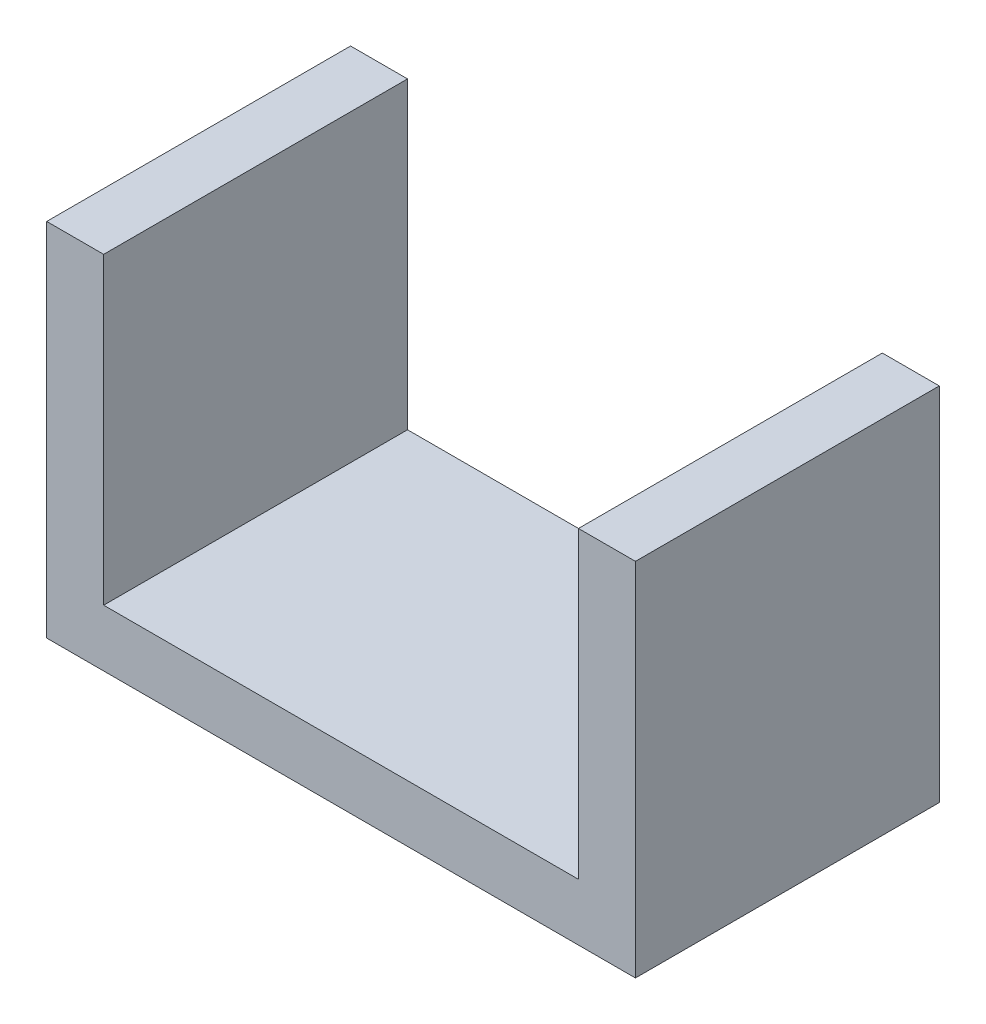
ISO-10303-21;
HEADER;
FILE_DESCRIPTION(('STEP AP214'),'2;1');
FILE_NAME('part.step','',(''),(''),'','','');
FILE_SCHEMA(('AUTOMOTIVE_DESIGN { 1 0 10303 214 1 1 1 1 }'));
ENDSEC;
DATA;
#1=APPLICATION_CONTEXT('core data for automotive mechanical design processes');
#2=APPLICATION_PROTOCOL_DEFINITION('international standard','automotive_design',2000,#1);
#3=PRODUCT_CONTEXT('',#1,'mechanical');
#4=PRODUCT('Part','Part','',(#3));
#5=PRODUCT_RELATED_PRODUCT_CATEGORY('part','',(#4));
#6=PRODUCT_DEFINITION_FORMATION('','',#4);
#7=PRODUCT_DEFINITION_CONTEXT('part definition',#1,'design');
#8=PRODUCT_DEFINITION('design','',#6,#7);
#9=PRODUCT_DEFINITION_SHAPE('','',#8);
#10=(LENGTH_UNIT() NAMED_UNIT(*) SI_UNIT(.MILLI.,.METRE.));
#11=(NAMED_UNIT(*) PLANE_ANGLE_UNIT() SI_UNIT($,.RADIAN.));
#12=(NAMED_UNIT(*) SI_UNIT($,.STERADIAN.) SOLID_ANGLE_UNIT());
#13=UNCERTAINTY_MEASURE_WITH_UNIT(LENGTH_MEASURE(1.E-05),#10,'distance_accuracy_value','');
#14=(GEOMETRIC_REPRESENTATION_CONTEXT(3) GLOBAL_UNCERTAINTY_ASSIGNED_CONTEXT((#13)) GLOBAL_UNIT_ASSIGNED_CONTEXT((#10,
#11,#12)) REPRESENTATION_CONTEXT('',''));
#15=CARTESIAN_POINT('',(0.,0.,0.));
#16=DIRECTION('',(0.,0.,1.));
#17=DIRECTION('',(1.,0.,0.));
#18=AXIS2_PLACEMENT_3D('',#15,#16,#17);
#19=CARTESIAN_POINT('',(-8.07882416440109,5.56775147928994,8.));
#20=DIRECTION('',(0.,-1.,0.));
#21=DIRECTION('',(0.,0.,-1.));
#22=AXIS2_PLACEMENT_3D('',#19,#20,#21);
#23=PLANE('',#22);
#24=DIRECTION('',(-1.,0.,0.));
#25=VECTOR('',#24,1.);
#26=CARTESIAN_POINT('',(-8.07882416440109,5.56775147928994,0.));
#27=LINE('',#26,#25);
#28=CARTESIAN_POINT('',(-8.07882416440109,5.56775147928994,0.));
#29=VERTEX_POINT('',#28);
#30=CARTESIAN_POINT('',(-9.57882416440109,5.56775147928994,0.));
#31=VERTEX_POINT('',#30);
#32=EDGE_CURVE('E140',#29,#31,#27,.T.);
#33=ORIENTED_EDGE('',*,*,#32,.T.);
#34=DIRECTION('',(0.,0.,-1.));
#35=VECTOR('',#34,1.);
#36=CARTESIAN_POINT('',(-9.57882416440109,5.56775147928994,8.));
#37=LINE('',#36,#35);
#38=CARTESIAN_POINT('',(-9.57882416440109,5.56775147928994,8.));
#39=VERTEX_POINT('',#38);
#40=EDGE_CURVE('E11',#39,#31,#37,.T.);
#41=ORIENTED_EDGE('',*,*,#40,.F.);
#42=DIRECTION('',(-1.,0.,0.));
#43=VECTOR('',#42,1.);
#44=CARTESIAN_POINT('',(-8.07882416440109,5.56775147928994,8.));
#45=LINE('',#44,#43);
#46=CARTESIAN_POINT('',(-8.07882416440109,5.56775147928994,8.));
#47=VERTEX_POINT('',#46);
#48=EDGE_CURVE('E162',#47,#39,#45,.T.);
#49=ORIENTED_EDGE('',*,*,#48,.F.);
#50=DIRECTION('',(0.,0.,-1.));
#51=VECTOR('',#50,1.);
#52=CARTESIAN_POINT('',(-8.07882416440109,5.56775147928994,8.));
#53=LINE('',#52,#51);
#54=EDGE_CURVE('E136',#47,#29,#53,.T.);
#55=ORIENTED_EDGE('',*,*,#54,.T.);
#56=EDGE_LOOP('',(#33,#41,#49,#55));
#57=FACE_BOUND('',#56,.T.);
#58=ADVANCED_FACE('F39',(#57),#23,.F.);
#59=CARTESIAN_POINT('',(-9.57882416440109,5.56775147928994,8.));
#60=DIRECTION('',(1.,0.,0.));
#61=DIRECTION('',(0.,0.,-1.));
#62=AXIS2_PLACEMENT_3D('',#59,#60,#61);
#63=PLANE('',#62);
#64=DIRECTION('',(0.,-1.,0.));
#65=VECTOR('',#64,1.);
#66=CARTESIAN_POINT('',(-9.57882416440109,5.56775147928994,0.));
#67=LINE('',#66,#65);
#68=CARTESIAN_POINT('',(-9.57882416440109,-3.93224852071006,0.));
#69=VERTEX_POINT('',#68);
#70=EDGE_CURVE('E144',#31,#69,#67,.T.);
#71=ORIENTED_EDGE('',*,*,#70,.T.);
#72=DIRECTION('',(0.,0.,-1.));
#73=VECTOR('',#72,1.);
#74=CARTESIAN_POINT('',(-9.57882416440109,-3.93224852071006,8.));
#75=LINE('',#74,#73);
#76=CARTESIAN_POINT('',(-9.57882416440109,-3.93224852071006,8.));
#77=VERTEX_POINT('',#76);
#78=EDGE_CURVE('E48',#77,#69,#75,.T.);
#79=ORIENTED_EDGE('',*,*,#78,.F.);
#80=DIRECTION('',(0.,-1.,0.));
#81=VECTOR('',#80,1.);
#82=CARTESIAN_POINT('',(-9.57882416440109,5.56775147928994,8.));
#83=LINE('',#82,#81);
#84=EDGE_CURVE('E99',#39,#77,#83,.T.);
#85=ORIENTED_EDGE('',*,*,#84,.F.);
#86=ORIENTED_EDGE('',*,*,#40,.T.);
#87=EDGE_LOOP('',(#71,#79,#85,#86));
#88=FACE_BOUND('',#87,.T.);
#89=ADVANCED_FACE('F208',(#88),#63,.F.);
#90=CARTESIAN_POINT('',(-9.57882416440109,-3.93224852071006,8.));
#91=DIRECTION('',(0.,1.,0.));
#92=DIRECTION('',(0.,0.,1.));
#93=AXIS2_PLACEMENT_3D('',#90,#91,#92);
#94=PLANE('',#93);
#95=DIRECTION('',(1.,0.,0.));
#96=VECTOR('',#95,1.);
#97=CARTESIAN_POINT('',(-9.57882416440109,-3.93224852071006,0.));
#98=LINE('',#97,#96);
#99=CARTESIAN_POINT('',(5.92117583559891,-3.93224852071006,0.));
#100=VERTEX_POINT('',#99);
#101=EDGE_CURVE('E147',#69,#100,#98,.T.);
#102=ORIENTED_EDGE('',*,*,#101,.T.);
#103=DIRECTION('',(0.,0.,-1.));
#104=VECTOR('',#103,1.);
#105=CARTESIAN_POINT('',(5.92117583559891,-3.93224852071006,8.));
#106=LINE('',#105,#104);
#107=CARTESIAN_POINT('',(5.92117583559891,-3.93224852071006,8.));
#108=VERTEX_POINT('',#107);
#109=EDGE_CURVE('E173',#108,#100,#106,.T.);
#110=ORIENTED_EDGE('',*,*,#109,.F.);
#111=DIRECTION('',(1.,0.,0.));
#112=VECTOR('',#111,1.);
#113=CARTESIAN_POINT('',(-9.57882416440109,-3.93224852071006,8.));
#114=LINE('',#113,#112);
#115=EDGE_CURVE('E183',#77,#108,#114,.T.);
#116=ORIENTED_EDGE('',*,*,#115,.F.);
#117=ORIENTED_EDGE('',*,*,#78,.T.);
#118=EDGE_LOOP('',(#102,#110,#116,#117));
#119=FACE_BOUND('',#118,.T.);
#120=ADVANCED_FACE('F181',(#119),#94,.F.);
#121=CARTESIAN_POINT('',(5.92117583559891,-3.93224852071006,8.));
#122=DIRECTION('',(-1.,0.,0.));
#123=DIRECTION('',(0.,-1.,0.));
#124=AXIS2_PLACEMENT_3D('',#121,#122,#123);
#125=PLANE('',#124);
#126=DIRECTION('',(0.,1.,0.));
#127=VECTOR('',#126,1.);
#128=CARTESIAN_POINT('',(5.92117583559891,-3.93224852071006,0.));
#129=LINE('',#128,#127);
#130=CARTESIAN_POINT('',(5.92117583559891,5.56775147928994,0.));
#131=VERTEX_POINT('',#130);
#132=EDGE_CURVE('E150',#100,#131,#129,.T.);
#133=ORIENTED_EDGE('',*,*,#132,.T.);
#134=DIRECTION('',(0.,0.,-1.));
#135=VECTOR('',#134,1.);
#136=CARTESIAN_POINT('',(5.92117583559891,5.56775147928994,8.));
#137=LINE('',#136,#135);
#138=CARTESIAN_POINT('',(5.92117583559891,5.56775147928994,8.));
#139=VERTEX_POINT('',#138);
#140=EDGE_CURVE('E169',#139,#131,#137,.T.);
#141=ORIENTED_EDGE('',*,*,#140,.F.);
#142=DIRECTION('',(0.,1.,0.));
#143=VECTOR('',#142,1.);
#144=CARTESIAN_POINT('',(5.92117583559891,-3.93224852071006,8.));
#145=LINE('',#144,#143);
#146=EDGE_CURVE('E196',#108,#139,#145,.T.);
#147=ORIENTED_EDGE('',*,*,#146,.F.);
#148=ORIENTED_EDGE('',*,*,#109,.T.);
#149=EDGE_LOOP('',(#133,#141,#147,#148));
#150=FACE_BOUND('',#149,.T.);
#151=ADVANCED_FACE('F191',(#150),#125,.F.);
#152=CARTESIAN_POINT('',(5.92117583559891,5.56775147928994,8.));
#153=DIRECTION('',(0.,-1.,0.));
#154=DIRECTION('',(0.,0.,-1.));
#155=AXIS2_PLACEMENT_3D('',#152,#153,#154);
#156=PLANE('',#155);
#157=DIRECTION('',(-1.,0.,0.));
#158=VECTOR('',#157,1.);
#159=CARTESIAN_POINT('',(5.92117583559891,5.56775147928994,0.));
#160=LINE('',#159,#158);
#161=CARTESIAN_POINT('',(4.42117583559891,5.56775147928994,0.));
#162=VERTEX_POINT('',#161);
#163=EDGE_CURVE('E153',#131,#162,#160,.T.);
#164=ORIENTED_EDGE('',*,*,#163,.T.);
#165=DIRECTION('',(0.,0.,-1.));
#166=VECTOR('',#165,1.);
#167=CARTESIAN_POINT('',(4.42117583559891,5.56775147928994,8.));
#168=LINE('',#167,#166);
#169=CARTESIAN_POINT('',(4.42117583559891,5.56775147928994,8.));
#170=VERTEX_POINT('',#169);
#171=EDGE_CURVE('E129',#170,#162,#168,.T.);
#172=ORIENTED_EDGE('',*,*,#171,.F.);
#173=DIRECTION('',(-1.,0.,0.));
#174=VECTOR('',#173,1.);
#175=CARTESIAN_POINT('',(5.92117583559891,5.56775147928994,8.));
#176=LINE('',#175,#174);
#177=EDGE_CURVE('E118',#139,#170,#176,.T.);
#178=ORIENTED_EDGE('',*,*,#177,.F.);
#179=ORIENTED_EDGE('',*,*,#140,.T.);
#180=EDGE_LOOP('',(#164,#172,#178,#179));
#181=FACE_BOUND('',#180,.T.);
#182=ADVANCED_FACE('F194',(#181),#156,.F.);
#183=CARTESIAN_POINT('',(4.42117583559891,5.56775147928994,8.));
#184=DIRECTION('',(1.,0.,0.));
#185=DIRECTION('',(0.,1.,0.));
#186=AXIS2_PLACEMENT_3D('',#183,#184,#185);
#187=PLANE('',#186);
#188=DIRECTION('',(0.,-1.,0.));
#189=VECTOR('',#188,1.);
#190=CARTESIAN_POINT('',(4.42117583559891,5.56775147928994,0.));
#191=LINE('',#190,#189);
#192=CARTESIAN_POINT('',(4.42117583559891,-2.43224852071006,0.));
#193=VERTEX_POINT('',#192);
#194=EDGE_CURVE('E127',#162,#193,#191,.T.);
#195=ORIENTED_EDGE('',*,*,#194,.T.);
#196=DIRECTION('',(0.,0.,-1.));
#197=VECTOR('',#196,1.);
#198=CARTESIAN_POINT('',(4.42117583559891,-2.43224852071006,8.));
#199=LINE('',#198,#197);
#200=CARTESIAN_POINT('',(4.42117583559891,-2.43224852071006,8.));
#201=VERTEX_POINT('',#200);
#202=EDGE_CURVE('E124',#201,#193,#199,.T.);
#203=ORIENTED_EDGE('',*,*,#202,.F.);
#204=DIRECTION('',(0.,-1.,0.));
#205=VECTOR('',#204,1.);
#206=CARTESIAN_POINT('',(4.42117583559891,5.56775147928994,8.));
#207=LINE('',#206,#205);
#208=EDGE_CURVE('E112',#170,#201,#207,.T.);
#209=ORIENTED_EDGE('',*,*,#208,.F.);
#210=ORIENTED_EDGE('',*,*,#171,.T.);
#211=EDGE_LOOP('',(#195,#203,#209,#210));
#212=FACE_BOUND('',#211,.T.);
#213=ADVANCED_FACE('F125',(#212),#187,.F.);
#214=CARTESIAN_POINT('',(4.42117583559891,-2.43224852071006,8.));
#215=DIRECTION('',(0.,-1.,0.));
#216=DIRECTION('',(1.,0.,0.));
#217=AXIS2_PLACEMENT_3D('',#214,#215,#216);
#218=PLANE('',#217);
#219=DIRECTION('',(-1.,0.,0.));
#220=VECTOR('',#219,1.);
#221=CARTESIAN_POINT('',(4.42117583559891,-2.43224852071006,0.));
#222=LINE('',#221,#220);
#223=CARTESIAN_POINT('',(-8.07882416440109,-2.43224852071006,0.));
#224=VERTEX_POINT('',#223);
#225=EDGE_CURVE('E85',#193,#224,#222,.T.);
#226=ORIENTED_EDGE('',*,*,#225,.T.);
#227=DIRECTION('',(0.,0.,-1.));
#228=VECTOR('',#227,1.);
#229=CARTESIAN_POINT('',(-8.07882416440109,-2.43224852071006,8.));
#230=LINE('',#229,#228);
#231=CARTESIAN_POINT('',(-8.07882416440109,-2.43224852071006,8.));
#232=VERTEX_POINT('',#231);
#233=EDGE_CURVE('E130',#232,#224,#230,.T.);
#234=ORIENTED_EDGE('',*,*,#233,.F.);
#235=DIRECTION('',(-1.,0.,0.));
#236=VECTOR('',#235,1.);
#237=CARTESIAN_POINT('',(4.42117583559891,-2.43224852071006,8.));
#238=LINE('',#237,#236);
#239=EDGE_CURVE('E116',#201,#232,#238,.T.);
#240=ORIENTED_EDGE('',*,*,#239,.F.);
#241=ORIENTED_EDGE('',*,*,#202,.T.);
#242=EDGE_LOOP('',(#226,#234,#240,#241));
#243=FACE_BOUND('',#242,.T.);
#244=ADVANCED_FACE('F132',(#243),#218,.F.);
#245=CARTESIAN_POINT('',(-8.07882416440109,-2.43224852071006,8.));
#246=DIRECTION('',(-1.,0.,0.));
#247=DIRECTION('',(0.,0.,1.));
#248=AXIS2_PLACEMENT_3D('',#245,#246,#247);
#249=PLANE('',#248);
#250=DIRECTION('',(0.,1.,0.));
#251=VECTOR('',#250,1.);
#252=CARTESIAN_POINT('',(-8.07882416440109,-2.43224852071006,0.));
#253=LINE('',#252,#251);
#254=EDGE_CURVE('E91',#224,#29,#253,.T.);
#255=ORIENTED_EDGE('',*,*,#254,.T.);
#256=ORIENTED_EDGE('',*,*,#54,.F.);
#257=DIRECTION('',(0.,1.,0.));
#258=VECTOR('',#257,1.);
#259=CARTESIAN_POINT('',(-8.07882416440109,-2.43224852071006,8.));
#260=LINE('',#259,#258);
#261=EDGE_CURVE('E56',#232,#47,#260,.T.);
#262=ORIENTED_EDGE('',*,*,#261,.F.);
#263=ORIENTED_EDGE('',*,*,#233,.T.);
#264=EDGE_LOOP('',(#255,#256,#262,#263));
#265=FACE_BOUND('',#264,.T.);
#266=ADVANCED_FACE('F224',(#265),#249,.F.);
#267=CARTESIAN_POINT('',(0.,0.,8.));
#268=DIRECTION('',(0.,0.,1.));
#269=DIRECTION('',(1.,0.,0.));
#270=AXIS2_PLACEMENT_3D('',#267,#268,#269);
#271=PLANE('',#270);
#272=ORIENTED_EDGE('',*,*,#48,.T.);
#273=ORIENTED_EDGE('',*,*,#84,.T.);
#274=ORIENTED_EDGE('',*,*,#115,.T.);
#275=ORIENTED_EDGE('',*,*,#146,.T.);
#276=ORIENTED_EDGE('',*,*,#177,.T.);
#277=ORIENTED_EDGE('',*,*,#208,.T.);
#278=ORIENTED_EDGE('',*,*,#239,.T.);
#279=ORIENTED_EDGE('',*,*,#261,.T.);
#280=EDGE_LOOP('',(#272,#273,#274,#275,#276,#277,#278,#279));
#281=FACE_BOUND('',#280,.T.);
#282=ADVANCED_FACE('F114',(#281),#271,.T.);
#283=CARTESIAN_POINT('',(0.,0.,0.));
#284=DIRECTION('',(0.,0.,1.));
#285=DIRECTION('',(1.,0.,0.));
#286=AXIS2_PLACEMENT_3D('',#283,#284,#285);
#287=PLANE('',#286);
#288=ORIENTED_EDGE('',*,*,#32,.F.);
#289=ORIENTED_EDGE('',*,*,#254,.F.);
#290=ORIENTED_EDGE('',*,*,#225,.F.);
#291=ORIENTED_EDGE('',*,*,#194,.F.);
#292=ORIENTED_EDGE('',*,*,#163,.F.);
#293=ORIENTED_EDGE('',*,*,#132,.F.);
#294=ORIENTED_EDGE('',*,*,#101,.F.);
#295=ORIENTED_EDGE('',*,*,#70,.F.);
#296=EDGE_LOOP('',(#288,#289,#290,#291,#292,#293,#294,#295));
#297=FACE_BOUND('',#296,.T.);
#298=ADVANCED_FACE('F187',(#297),#287,.F.);
#299=CLOSED_SHELL('',(#58,#89,#120,#151,#182,#213,#244,#266,#282,#298));
#300=MANIFOLD_SOLID_BREP('B2',#299);
#301=ADVANCED_BREP_SHAPE_REPRESENTATION('',(#18,#300),#14);
#302=SHAPE_DEFINITION_REPRESENTATION(#9,#301);
ENDSEC;
END-ISO-10303-21;
